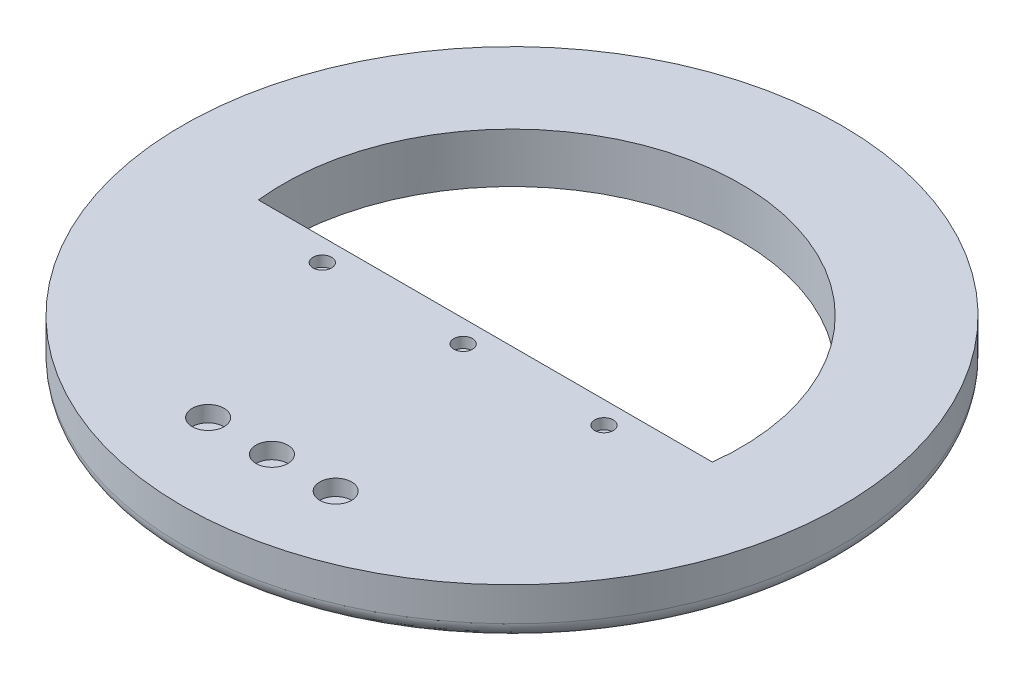
ISO-10303-21;
HEADER;
FILE_DESCRIPTION(('STEP AP214'),'2;1');
FILE_NAME('part.step','',(''),(''),'','','');
FILE_SCHEMA(('AUTOMOTIVE_DESIGN { 1 0 10303 214 1 1 1 1 }'));
ENDSEC;
DATA;
#1=APPLICATION_CONTEXT('core data for automotive mechanical design processes');
#2=APPLICATION_PROTOCOL_DEFINITION('international standard','automotive_design',2000,#1);
#3=PRODUCT_CONTEXT('',#1,'mechanical');
#4=PRODUCT('Part','Part','',(#3));
#5=PRODUCT_RELATED_PRODUCT_CATEGORY('part','',(#4));
#6=PRODUCT_DEFINITION_FORMATION('','',#4);
#7=PRODUCT_DEFINITION_CONTEXT('part definition',#1,'design');
#8=PRODUCT_DEFINITION('design','',#6,#7);
#9=PRODUCT_DEFINITION_SHAPE('','',#8);
#10=(LENGTH_UNIT() NAMED_UNIT(*) SI_UNIT(.MILLI.,.METRE.));
#11=(NAMED_UNIT(*) PLANE_ANGLE_UNIT() SI_UNIT($,.RADIAN.));
#12=(NAMED_UNIT(*) SI_UNIT($,.STERADIAN.) SOLID_ANGLE_UNIT());
#13=UNCERTAINTY_MEASURE_WITH_UNIT(LENGTH_MEASURE(1.E-05),#10,'distance_accuracy_value','');
#14=(GEOMETRIC_REPRESENTATION_CONTEXT(3) GLOBAL_UNCERTAINTY_ASSIGNED_CONTEXT((#13)) GLOBAL_UNIT_ASSIGNED_CONTEXT((#10,
#11,#12)) REPRESENTATION_CONTEXT('',''));
#15=CARTESIAN_POINT('',(0.,0.,0.));
#16=DIRECTION('',(0.,0.,1.));
#17=DIRECTION('',(1.,0.,0.));
#18=AXIS2_PLACEMENT_3D('',#15,#16,#17);
#19=CARTESIAN_POINT('',(0.,-43.8991020898251,0.));
#20=DIRECTION('',(0.,1.,0.));
#21=DIRECTION('',(0.,0.,1.));
#22=AXIS2_PLACEMENT_3D('',#19,#20,#21);
#23=PLANE('',#22);
#24=CARTESIAN_POINT('',(-32.2248616665965,-43.8991020898251,45.1687405670526));
#25=DIRECTION('',(0.,1.,0.));
#26=DIRECTION('',(0.,0.,1.));
#27=AXIS2_PLACEMENT_3D('',#24,#25,#26);
#28=CIRCLE('',#27,3.);
#29=CARTESIAN_POINT('',(-32.2248616665965,-43.8991020898251,48.1687405670526));
#30=VERTEX_POINT('',#29);
#31=EDGE_CURVE('E231',#30,#30,#28,.T.);
#32=ORIENTED_EDGE('',*,*,#31,.F.);
#33=EDGE_LOOP('',(#32));
#34=FACE_BOUND('',#33,.T.);
#35=CARTESIAN_POINT('',(-8.22738053249132,-43.8991020898251,45.1687405670525));
#36=DIRECTION('',(0.,1.,0.));
#37=DIRECTION('',(0.,0.,1.));
#38=AXIS2_PLACEMENT_3D('',#35,#36,#37);
#39=CIRCLE('',#38,3.);
#40=CARTESIAN_POINT('',(-8.22738053249132,-43.8991020898251,48.1687405670525));
#41=VERTEX_POINT('',#40);
#42=EDGE_CURVE('E221',#41,#41,#39,.T.);
#43=ORIENTED_EDGE('',*,*,#42,.F.);
#44=EDGE_LOOP('',(#43));
#45=FACE_BOUND('',#44,.T.);
#46=CARTESIAN_POINT('',(-20.2261210995441,-43.8991020898251,45.1687405670526));
#47=DIRECTION('',(0.,1.,0.));
#48=DIRECTION('',(0.,0.,1.));
#49=AXIS2_PLACEMENT_3D('',#46,#47,#48);
#50=CIRCLE('',#49,3.);
#51=CARTESIAN_POINT('',(-20.2261210995441,-43.8991020898251,48.1687405670526));
#52=VERTEX_POINT('',#51);
#53=EDGE_CURVE('E224',#52,#52,#50,.T.);
#54=ORIENTED_EDGE('',*,*,#53,.F.);
#55=EDGE_LOOP('',(#54));
#56=FACE_BOUND('',#55,.T.);
#57=CARTESIAN_POINT('',(-20.2261210995441,-43.8991020898251,0.));
#58=DIRECTION('',(0.,1.,0.));
#59=DIRECTION('',(0.,0.,1.));
#60=AXIS2_PLACEMENT_3D('',#57,#58,#59);
#61=CIRCLE('',#60,62.);
#62=CARTESIAN_POINT('',(-20.2261210995441,-43.8991020898251,62.));
#63=VERTEX_POINT('',#62);
#64=EDGE_CURVE('E51',#63,#63,#61,.T.);
#65=ORIENTED_EDGE('',*,*,#64,.T.);
#66=EDGE_LOOP('',(#65));
#67=FACE_BOUND('',#66,.T.);
#68=DIRECTION('',(1.,0.,0.));
#69=VECTOR('',#68,1.);
#70=CARTESIAN_POINT('',(-42.0206158172475,-43.8991020898251,5.));
#71=LINE('',#70,#69);
#72=CARTESIAN_POINT('',(-62.9344341076693,-43.8991020898251,5.));
#73=VERTEX_POINT('',#72);
#74=CARTESIAN_POINT('',(22.4821919085812,-43.8991020898251,5.));
#75=VERTEX_POINT('',#74);
#76=EDGE_CURVE('E88',#73,#75,#71,.T.);
#77=ORIENTED_EDGE('',*,*,#76,.F.);
#78=CARTESIAN_POINT('',(-20.2261210995441,-43.8991020898251,0.));
#79=DIRECTION('',(0.,-1.,0.));
#80=DIRECTION('',(0.,0.,-1.));
#81=AXIS2_PLACEMENT_3D('',#78,#79,#80);
#82=CIRCLE('',#81,43.);
#83=EDGE_CURVE('E11',#75,#73,#82,.F.);
#84=ORIENTED_EDGE('',*,*,#83,.F.);
#85=EDGE_LOOP('',(#77,#84));
#86=FACE_BOUND('',#85,.T.);
#87=CARTESIAN_POINT('',(-20.2261210995441,-43.8991020898251,9.19));
#88=DIRECTION('',(0.,1.,0.));
#89=DIRECTION('',(0.,0.,1.));
#90=AXIS2_PLACEMENT_3D('',#87,#88,#89);
#91=CIRCLE('',#90,1.75);
#92=CARTESIAN_POINT('',(-20.2261210995441,-43.8991020898251,10.94));
#93=VERTEX_POINT('',#92);
#94=EDGE_CURVE('E101',#93,#93,#91,.T.);
#95=ORIENTED_EDGE('',*,*,#94,.F.);
#96=EDGE_LOOP('',(#95));
#97=FACE_BOUND('',#96,.T.);
#98=CARTESIAN_POINT('',(6.27387890045591,-43.8991020898251,9.19));
#99=DIRECTION('',(0.,1.,0.));
#100=DIRECTION('',(0.,0.,1.));
#101=AXIS2_PLACEMENT_3D('',#98,#99,#100);
#102=CIRCLE('',#101,1.75);
#103=CARTESIAN_POINT('',(6.27387890045591,-43.8991020898251,10.94));
#104=VERTEX_POINT('',#103);
#105=EDGE_CURVE('E105',#104,#104,#102,.T.);
#106=ORIENTED_EDGE('',*,*,#105,.F.);
#107=EDGE_LOOP('',(#106));
#108=FACE_BOUND('',#107,.T.);
#109=CARTESIAN_POINT('',(-46.7261210995441,-43.8991020898251,9.19));
#110=DIRECTION('',(0.,1.,0.));
#111=DIRECTION('',(0.,0.,1.));
#112=AXIS2_PLACEMENT_3D('',#109,#110,#111);
#113=CIRCLE('',#112,1.75);
#114=CARTESIAN_POINT('',(-46.7261210995441,-43.8991020898251,10.94));
#115=VERTEX_POINT('',#114);
#116=EDGE_CURVE('E112',#115,#115,#113,.T.);
#117=ORIENTED_EDGE('',*,*,#116,.F.);
#118=EDGE_LOOP('',(#117));
#119=FACE_BOUND('',#118,.T.);
#120=ADVANCED_FACE('F47',(#34,#45,#56,#67,#86,#97,#108,#119),#23,.T.);
#121=CARTESIAN_POINT('',(-46.7261210995441,-45.8991020898251,9.19));
#122=DIRECTION('',(0.,1.,0.));
#123=DIRECTION('',(0.,0.,1.));
#124=AXIS2_PLACEMENT_3D('',#121,#122,#123);
#125=PLANE('',#124);
#126=CARTESIAN_POINT('',(-46.7261210995441,-45.8991020898251,9.19));
#127=DIRECTION('',(0.,1.,0.));
#128=DIRECTION('',(0.,0.,1.));
#129=AXIS2_PLACEMENT_3D('',#126,#127,#128);
#130=CIRCLE('',#129,1.75);
#131=CARTESIAN_POINT('',(-46.7261210995441,-45.8991020898251,10.94));
#132=VERTEX_POINT('',#131);
#133=EDGE_CURVE('E57',#132,#132,#130,.T.);
#134=ORIENTED_EDGE('',*,*,#133,.T.);
#135=EDGE_LOOP('',(#134));
#136=FACE_BOUND('',#135,.T.);
#137=ADVANCED_FACE('F128',(#136),#125,.T.);
#138=CARTESIAN_POINT('',(-46.7261210995441,-45.8991020898251,9.19));
#139=DIRECTION('',(0.,1.,0.));
#140=DIRECTION('',(0.,0.,1.));
#141=AXIS2_PLACEMENT_3D('',#138,#139,#140);
#142=CYLINDRICAL_SURFACE('',#141,1.75);
#143=ORIENTED_EDGE('',*,*,#133,.F.);
#144=EDGE_LOOP('',(#143));
#145=FACE_BOUND('',#144,.T.);
#146=ORIENTED_EDGE('',*,*,#116,.T.);
#147=EDGE_LOOP('',(#146));
#148=FACE_BOUND('',#147,.T.);
#149=ADVANCED_FACE('F134',(#145,#148),#142,.F.);
#150=CARTESIAN_POINT('',(6.27387890045591,-45.8991020898251,9.19));
#151=DIRECTION('',(0.,1.,0.));
#152=DIRECTION('',(0.,0.,1.));
#153=AXIS2_PLACEMENT_3D('',#150,#151,#152);
#154=PLANE('',#153);
#155=CARTESIAN_POINT('',(6.27387890045591,-45.8991020898251,9.19));
#156=DIRECTION('',(0.,1.,0.));
#157=DIRECTION('',(0.,0.,1.));
#158=AXIS2_PLACEMENT_3D('',#155,#156,#157);
#159=CIRCLE('',#158,1.75);
#160=CARTESIAN_POINT('',(6.27387890045591,-45.8991020898251,10.94));
#161=VERTEX_POINT('',#160);
#162=EDGE_CURVE('E116',#161,#161,#159,.T.);
#163=ORIENTED_EDGE('',*,*,#162,.T.);
#164=EDGE_LOOP('',(#163));
#165=FACE_BOUND('',#164,.T.);
#166=ADVANCED_FACE('F136',(#165),#154,.T.);
#167=CARTESIAN_POINT('',(6.27387890045591,-45.8991020898251,9.19));
#168=DIRECTION('',(0.,1.,0.));
#169=DIRECTION('',(0.,0.,1.));
#170=AXIS2_PLACEMENT_3D('',#167,#168,#169);
#171=CYLINDRICAL_SURFACE('',#170,1.75);
#172=ORIENTED_EDGE('',*,*,#162,.F.);
#173=EDGE_LOOP('',(#172));
#174=FACE_BOUND('',#173,.T.);
#175=ORIENTED_EDGE('',*,*,#105,.T.);
#176=EDGE_LOOP('',(#175));
#177=FACE_BOUND('',#176,.T.);
#178=ADVANCED_FACE('F124',(#174,#177),#171,.F.);
#179=CARTESIAN_POINT('',(-20.2261210995441,-45.8991020898251,9.19));
#180=DIRECTION('',(0.,1.,0.));
#181=DIRECTION('',(0.,0.,1.));
#182=AXIS2_PLACEMENT_3D('',#179,#180,#181);
#183=PLANE('',#182);
#184=CARTESIAN_POINT('',(-20.2261210995441,-45.8991020898251,9.19));
#185=DIRECTION('',(0.,1.,0.));
#186=DIRECTION('',(0.,0.,1.));
#187=AXIS2_PLACEMENT_3D('',#184,#185,#186);
#188=CIRCLE('',#187,1.75);
#189=CARTESIAN_POINT('',(-20.2261210995441,-45.8991020898251,10.94));
#190=VERTEX_POINT('',#189);
#191=EDGE_CURVE('E97',#190,#190,#188,.T.);
#192=ORIENTED_EDGE('',*,*,#191,.T.);
#193=EDGE_LOOP('',(#192));
#194=FACE_BOUND('',#193,.T.);
#195=ADVANCED_FACE('F151',(#194),#183,.T.);
#196=CARTESIAN_POINT('',(-20.2261210995441,-45.8991020898251,9.19));
#197=DIRECTION('',(0.,1.,0.));
#198=DIRECTION('',(0.,0.,1.));
#199=AXIS2_PLACEMENT_3D('',#196,#197,#198);
#200=CYLINDRICAL_SURFACE('',#199,1.75);
#201=ORIENTED_EDGE('',*,*,#191,.F.);
#202=EDGE_LOOP('',(#201));
#203=FACE_BOUND('',#202,.T.);
#204=ORIENTED_EDGE('',*,*,#94,.T.);
#205=EDGE_LOOP('',(#204));
#206=FACE_BOUND('',#205,.T.);
#207=ADVANCED_FACE('F156',(#203,#206),#200,.F.);
#208=CARTESIAN_POINT('',(-20.2261210995441,-53.2611233647485,0.));
#209=DIRECTION('',(0.,1.,0.));
#210=DIRECTION('',(0.,0.,1.));
#211=AXIS2_PLACEMENT_3D('',#208,#209,#210);
#212=CYLINDRICAL_SURFACE('',#211,62.);
#213=CARTESIAN_POINT('',(-20.2261210995441,-50.2611233647485,0.));
#214=DIRECTION('',(0.,-1.,0.));
#215=DIRECTION('',(0.,0.,-1.));
#216=AXIS2_PLACEMENT_3D('',#213,#214,#215);
#217=CIRCLE('',#216,62.);
#218=CARTESIAN_POINT('',(-20.2261210995441,-50.2611233647485,-62.));
#219=VERTEX_POINT('',#218);
#220=EDGE_CURVE('E244',#219,#219,#217,.F.);
#221=ORIENTED_EDGE('',*,*,#220,.T.);
#222=EDGE_LOOP('',(#221));
#223=FACE_BOUND('',#222,.T.);
#224=ORIENTED_EDGE('',*,*,#64,.F.);
#225=EDGE_LOOP('',(#224));
#226=FACE_BOUND('',#225,.T.);
#227=ADVANCED_FACE('F49',(#223,#226),#212,.T.);
#228=CARTESIAN_POINT('',(-20.2261210995441,-53.2611233647485,0.));
#229=DIRECTION('',(0.,1.,0.));
#230=DIRECTION('',(0.,0.,1.));
#231=AXIS2_PLACEMENT_3D('',#228,#229,#230);
#232=CYLINDRICAL_SURFACE('',#231,43.);
#233=ORIENTED_EDGE('',*,*,#83,.T.);
#234=DIRECTION('',(0.,1.,0.));
#235=VECTOR('',#234,1.);
#236=CARTESIAN_POINT('',(-62.9344341076693,-53.2611233647485,5.));
#237=LINE('',#236,#235);
#238=CARTESIAN_POINT('',(-62.9344341076693,-49.6559486508227,5.));
#239=VERTEX_POINT('',#238);
#240=EDGE_CURVE('E85',#239,#73,#237,.T.);
#241=ORIENTED_EDGE('',*,*,#240,.F.);
#242=CARTESIAN_POINT('',(-20.2261210995441,-49.6559486508227,0.));
#243=DIRECTION('',(0.,1.,0.));
#244=DIRECTION('',(0.,0.,1.));
#245=AXIS2_PLACEMENT_3D('',#242,#243,#244);
#246=CIRCLE('',#245,43.);
#247=CARTESIAN_POINT('',(22.4821919085812,-49.6559486508227,5.));
#248=VERTEX_POINT('',#247);
#249=EDGE_CURVE('E67',#239,#248,#246,.T.);
#250=ORIENTED_EDGE('',*,*,#249,.T.);
#251=DIRECTION('',(0.,1.,0.));
#252=VECTOR('',#251,1.);
#253=CARTESIAN_POINT('',(22.4821919085812,-53.2611233647485,5.));
#254=LINE('',#253,#252);
#255=EDGE_CURVE('E86',#75,#248,#254,.F.);
#256=ORIENTED_EDGE('',*,*,#255,.F.);
#257=EDGE_LOOP('',(#233,#241,#250,#256));
#258=FACE_BOUND('',#257,.T.);
#259=CARTESIAN_POINT('',(-20.2261210995441,-53.2611233647485,0.));
#260=DIRECTION('',(0.,-1.,0.));
#261=DIRECTION('',(0.,0.,-1.));
#262=AXIS2_PLACEMENT_3D('',#259,#260,#261);
#263=CIRCLE('',#262,43.);
#264=CARTESIAN_POINT('',(-20.2261210995441,-53.2611233647485,-43.));
#265=VERTEX_POINT('',#264);
#266=EDGE_CURVE('E78',#265,#265,#263,.T.);
#267=ORIENTED_EDGE('',*,*,#266,.T.);
#268=EDGE_LOOP('',(#267));
#269=FACE_BOUND('',#268,.T.);
#270=ADVANCED_FACE('F91',(#258,#269),#232,.F.);
#271=CARTESIAN_POINT('',(-20.2261210995441,-53.2611233647485,0.));
#272=DIRECTION('',(0.,-1.,0.));
#273=DIRECTION('',(0.,0.,-1.));
#274=AXIS2_PLACEMENT_3D('',#271,#272,#273);
#275=PLANE('',#274);
#276=ORIENTED_EDGE('',*,*,#266,.F.);
#277=EDGE_LOOP('',(#276));
#278=FACE_BOUND('',#277,.T.);
#279=CARTESIAN_POINT('',(-20.2261210995441,-53.2611233647485,0.));
#280=DIRECTION('',(0.,-1.,0.));
#281=DIRECTION('',(0.,0.,-1.));
#282=AXIS2_PLACEMENT_3D('',#279,#280,#281);
#283=CIRCLE('',#282,51.);
#284=CARTESIAN_POINT('',(-20.2261210995441,-53.2611233647485,-51.));
#285=VERTEX_POINT('',#284);
#286=EDGE_CURVE('E89',#285,#285,#283,.T.);
#287=ORIENTED_EDGE('',*,*,#286,.T.);
#288=EDGE_LOOP('',(#287));
#289=FACE_BOUND('',#288,.T.);
#290=ADVANCED_FACE('F184',(#278,#289),#275,.T.);
#291=CARTESIAN_POINT('',(-20.2261210995441,-53.2611233647485,0.));
#292=DIRECTION('',(0.,-1.,0.));
#293=DIRECTION('',(0.,0.,-1.));
#294=AXIS2_PLACEMENT_3D('',#291,#292,#293);
#295=CIRCLE('',#294,59.);
#296=CARTESIAN_POINT('',(-20.2261210995441,-53.2611233647485,-59.));
#297=VERTEX_POINT('',#296);
#298=EDGE_CURVE('E79',#297,#297,#295,.T.);
#299=ORIENTED_EDGE('',*,*,#298,.T.);
#300=EDGE_LOOP('',(#299));
#301=FACE_BOUND('',#300,.T.);
#302=CARTESIAN_POINT('',(-20.2261210995441,-53.2611233647485,0.));
#303=DIRECTION('',(0.,-1.,0.));
#304=DIRECTION('',(0.,0.,-1.));
#305=AXIS2_PLACEMENT_3D('',#302,#303,#304);
#306=CIRCLE('',#305,54.75);
#307=CARTESIAN_POINT('',(-20.2261210995441,-53.2611233647485,-54.75));
#308=VERTEX_POINT('',#307);
#309=EDGE_CURVE('E255',#308,#308,#306,.T.);
#310=ORIENTED_EDGE('',*,*,#309,.F.);
#311=EDGE_LOOP('',(#310));
#312=FACE_BOUND('',#311,.T.);
#313=ADVANCED_FACE('F180',(#301,#312),#275,.T.);
#314=CARTESIAN_POINT('',(-20.2261210995441,-46.2611233647485,0.));
#315=DIRECTION('',(0.,-1.,0.));
#316=DIRECTION('',(0.,0.,-1.));
#317=AXIS2_PLACEMENT_3D('',#314,#315,#316);
#318=CYLINDRICAL_SURFACE('',#317,54.75);
#319=CARTESIAN_POINT('',(-20.2261210995441,-46.2611233647485,0.));
#320=DIRECTION('',(0.,-1.,0.));
#321=DIRECTION('',(0.,0.,-1.));
#322=AXIS2_PLACEMENT_3D('',#319,#320,#321);
#323=CIRCLE('',#322,54.75);
#324=CARTESIAN_POINT('',(-20.2261210995441,-46.2611233647485,-54.75));
#325=VERTEX_POINT('',#324);
#326=EDGE_CURVE('E254',#325,#325,#323,.T.);
#327=ORIENTED_EDGE('',*,*,#326,.F.);
#328=EDGE_LOOP('',(#327));
#329=FACE_BOUND('',#328,.T.);
#330=ORIENTED_EDGE('',*,*,#309,.T.);
#331=EDGE_LOOP('',(#330));
#332=FACE_BOUND('',#331,.T.);
#333=ADVANCED_FACE('F176',(#329,#332),#318,.F.);
#334=CARTESIAN_POINT('',(-20.2261210995441,-46.2611233647485,0.));
#335=DIRECTION('',(0.,-1.,0.));
#336=DIRECTION('',(0.,0.,-1.));
#337=AXIS2_PLACEMENT_3D('',#334,#335,#336);
#338=PLANE('',#337);
#339=CARTESIAN_POINT('',(-20.2261210995441,-46.2611233647485,0.));
#340=DIRECTION('',(0.,-1.,0.));
#341=DIRECTION('',(0.,0.,-1.));
#342=AXIS2_PLACEMENT_3D('',#339,#340,#341);
#343=CIRCLE('',#342,51.);
#344=CARTESIAN_POINT('',(-20.2261210995441,-46.2611233647485,-51.));
#345=VERTEX_POINT('',#344);
#346=EDGE_CURVE('E259',#345,#345,#343,.T.);
#347=ORIENTED_EDGE('',*,*,#346,.F.);
#348=EDGE_LOOP('',(#347));
#349=FACE_BOUND('',#348,.T.);
#350=ORIENTED_EDGE('',*,*,#326,.T.);
#351=EDGE_LOOP('',(#350));
#352=FACE_BOUND('',#351,.T.);
#353=ADVANCED_FACE('F172',(#349,#352),#338,.T.);
#354=CARTESIAN_POINT('',(-20.2261210995441,-46.2611233647485,0.));
#355=DIRECTION('',(0.,-1.,0.));
#356=DIRECTION('',(0.,0.,-1.));
#357=AXIS2_PLACEMENT_3D('',#354,#355,#356);
#358=CYLINDRICAL_SURFACE('',#357,51.);
#359=ORIENTED_EDGE('',*,*,#346,.T.);
#360=EDGE_LOOP('',(#359));
#361=FACE_BOUND('',#360,.T.);
#362=ORIENTED_EDGE('',*,*,#286,.F.);
#363=EDGE_LOOP('',(#362));
#364=FACE_BOUND('',#363,.T.);
#365=ADVANCED_FACE('F169',(#361,#364),#358,.T.);
#366=CARTESIAN_POINT('',(1.56837361815929,-49.6559486508227,5.));
#367=DIRECTION('',(0.,1.,0.));
#368=DIRECTION('',(0.,0.,1.));
#369=AXIS2_PLACEMENT_3D('',#366,#367,#368);
#370=PLANE('',#369);
#371=ORIENTED_EDGE('',*,*,#249,.F.);
#372=DIRECTION('',(-1.,0.,0.));
#373=VECTOR('',#372,1.);
#374=CARTESIAN_POINT('',(1.56837361815929,-49.6559486508227,5.));
#375=LINE('',#374,#373);
#376=EDGE_CURVE('E75',#248,#239,#375,.T.);
#377=ORIENTED_EDGE('',*,*,#376,.F.);
#378=EDGE_LOOP('',(#371,#377));
#379=FACE_BOUND('',#378,.T.);
#380=ADVANCED_FACE('F74',(#379),#370,.F.);
#381=CARTESIAN_POINT('',(0.,0.,5.));
#382=DIRECTION('',(0.,0.,-1.));
#383=DIRECTION('',(-1.,0.,0.));
#384=AXIS2_PLACEMENT_3D('',#381,#382,#383);
#385=PLANE('',#384);
#386=ORIENTED_EDGE('',*,*,#76,.T.);
#387=ORIENTED_EDGE('',*,*,#255,.T.);
#388=ORIENTED_EDGE('',*,*,#376,.T.);
#389=ORIENTED_EDGE('',*,*,#240,.T.);
#390=EDGE_LOOP('',(#386,#387,#388,#389));
#391=FACE_BOUND('',#390,.T.);
#392=ADVANCED_FACE('F84',(#391),#385,.T.);
#393=CARTESIAN_POINT('',(-20.2261210995441,-50.2611233647485,0.));
#394=DIRECTION('',(0.,-1.,0.));
#395=DIRECTION('',(0.,0.,-1.));
#396=AXIS2_PLACEMENT_3D('',#393,#394,#395);
#397=TOROIDAL_SURFACE('',#396,59.,3.);
#398=ORIENTED_EDGE('',*,*,#220,.F.);
#399=EDGE_LOOP('',(#398));
#400=FACE_BOUND('',#399,.T.);
#401=ORIENTED_EDGE('',*,*,#298,.F.);
#402=EDGE_LOOP('',(#401));
#403=FACE_BOUND('',#402,.T.);
#404=ADVANCED_FACE('F131',(#400,#403),#397,.T.);
#405=CARTESIAN_POINT('',(-20.2261210995441,-46.8991020898251,45.1687405670526));
#406=DIRECTION('',(0.,1.,0.));
#407=DIRECTION('',(0.,0.,1.));
#408=AXIS2_PLACEMENT_3D('',#405,#406,#407);
#409=CYLINDRICAL_SURFACE('',#408,3.);
#410=CARTESIAN_POINT('',(-20.2261210995441,-46.8991020898251,45.1687405670526));
#411=DIRECTION('',(0.,1.,0.));
#412=DIRECTION('',(0.,0.,1.));
#413=AXIS2_PLACEMENT_3D('',#410,#411,#412);
#414=CIRCLE('',#413,3.);
#415=CARTESIAN_POINT('',(-20.2261210995441,-46.8991020898251,48.1687405670526));
#416=VERTEX_POINT('',#415);
#417=EDGE_CURVE('E229',#416,#416,#414,.T.);
#418=ORIENTED_EDGE('',*,*,#417,.F.);
#419=EDGE_LOOP('',(#418));
#420=FACE_BOUND('',#419,.T.);
#421=ORIENTED_EDGE('',*,*,#53,.T.);
#422=EDGE_LOOP('',(#421));
#423=FACE_BOUND('',#422,.T.);
#424=ADVANCED_FACE('F130',(#420,#423),#409,.F.);
#425=CARTESIAN_POINT('',(0.,-46.8991020898251,0.));
#426=DIRECTION('',(0.,1.,0.));
#427=DIRECTION('',(0.,0.,1.));
#428=AXIS2_PLACEMENT_3D('',#425,#426,#427);
#429=PLANE('',#428);
#430=ORIENTED_EDGE('',*,*,#417,.T.);
#431=EDGE_LOOP('',(#430));
#432=FACE_BOUND('',#431,.T.);
#433=ADVANCED_FACE('F193',(#432),#429,.T.);
#434=CARTESIAN_POINT('',(-8.22738053249132,-46.8991020898251,45.1687405670525));
#435=DIRECTION('',(0.,1.,0.));
#436=DIRECTION('',(0.,0.,1.));
#437=AXIS2_PLACEMENT_3D('',#434,#435,#436);
#438=CYLINDRICAL_SURFACE('',#437,3.);
#439=CARTESIAN_POINT('',(-8.22738053249132,-46.8991020898251,45.1687405670525));
#440=DIRECTION('',(0.,1.,0.));
#441=DIRECTION('',(0.,0.,1.));
#442=AXIS2_PLACEMENT_3D('',#439,#440,#441);
#443=CIRCLE('',#442,3.);
#444=CARTESIAN_POINT('',(-8.22738053249132,-46.8991020898251,48.1687405670525));
#445=VERTEX_POINT('',#444);
#446=EDGE_CURVE('E218',#445,#445,#443,.T.);
#447=ORIENTED_EDGE('',*,*,#446,.F.);
#448=EDGE_LOOP('',(#447));
#449=FACE_BOUND('',#448,.T.);
#450=ORIENTED_EDGE('',*,*,#42,.T.);
#451=EDGE_LOOP('',(#450));
#452=FACE_BOUND('',#451,.T.);
#453=ADVANCED_FACE('F197',(#449,#452),#438,.F.);
#454=CARTESIAN_POINT('',(0.,-46.8991020898251,0.));
#455=DIRECTION('',(0.,1.,0.));
#456=DIRECTION('',(0.,0.,1.));
#457=AXIS2_PLACEMENT_3D('',#454,#455,#456);
#458=PLANE('',#457);
#459=ORIENTED_EDGE('',*,*,#446,.T.);
#460=EDGE_LOOP('',(#459));
#461=FACE_BOUND('',#460,.T.);
#462=ADVANCED_FACE('F206',(#461),#458,.T.);
#463=CARTESIAN_POINT('',(-32.2248616665965,-46.8991020898251,45.1687405670526));
#464=DIRECTION('',(0.,1.,0.));
#465=DIRECTION('',(0.,0.,1.));
#466=AXIS2_PLACEMENT_3D('',#463,#464,#465);
#467=CYLINDRICAL_SURFACE('',#466,3.);
#468=CARTESIAN_POINT('',(-32.2248616665965,-46.8991020898251,45.1687405670526));
#469=DIRECTION('',(0.,1.,0.));
#470=DIRECTION('',(0.,0.,1.));
#471=AXIS2_PLACEMENT_3D('',#468,#469,#470);
#472=CIRCLE('',#471,3.);
#473=CARTESIAN_POINT('',(-32.2248616665965,-46.8991020898251,48.1687405670526));
#474=VERTEX_POINT('',#473);
#475=EDGE_CURVE('E237',#474,#474,#472,.T.);
#476=ORIENTED_EDGE('',*,*,#475,.F.);
#477=EDGE_LOOP('',(#476));
#478=FACE_BOUND('',#477,.T.);
#479=ORIENTED_EDGE('',*,*,#31,.T.);
#480=EDGE_LOOP('',(#479));
#481=FACE_BOUND('',#480,.T.);
#482=ADVANCED_FACE('F202',(#478,#481),#467,.F.);
#483=CARTESIAN_POINT('',(-32.2248616665965,-46.8991020898251,45.1687405670526));
#484=DIRECTION('',(0.,1.,0.));
#485=DIRECTION('',(0.,0.,1.));
#486=AXIS2_PLACEMENT_3D('',#483,#484,#485);
#487=PLANE('',#486);
#488=ORIENTED_EDGE('',*,*,#475,.T.);
#489=EDGE_LOOP('',(#488));
#490=FACE_BOUND('',#489,.T.);
#491=ADVANCED_FACE('F199',(#490),#487,.T.);
#492=CLOSED_SHELL('',(#120,#137,#149,#166,#178,#195,#207,#227,#270,#290,#313,#333,#353,#365,
#380,#392,#404,#424,#433,#453,#462,#482,#491));
#493=MANIFOLD_SOLID_BREP('B2',#492);
#494=ADVANCED_BREP_SHAPE_REPRESENTATION('',(#18,#493),#14);
#495=SHAPE_DEFINITION_REPRESENTATION(#9,#494);
ENDSEC;
END-ISO-10303-21;
